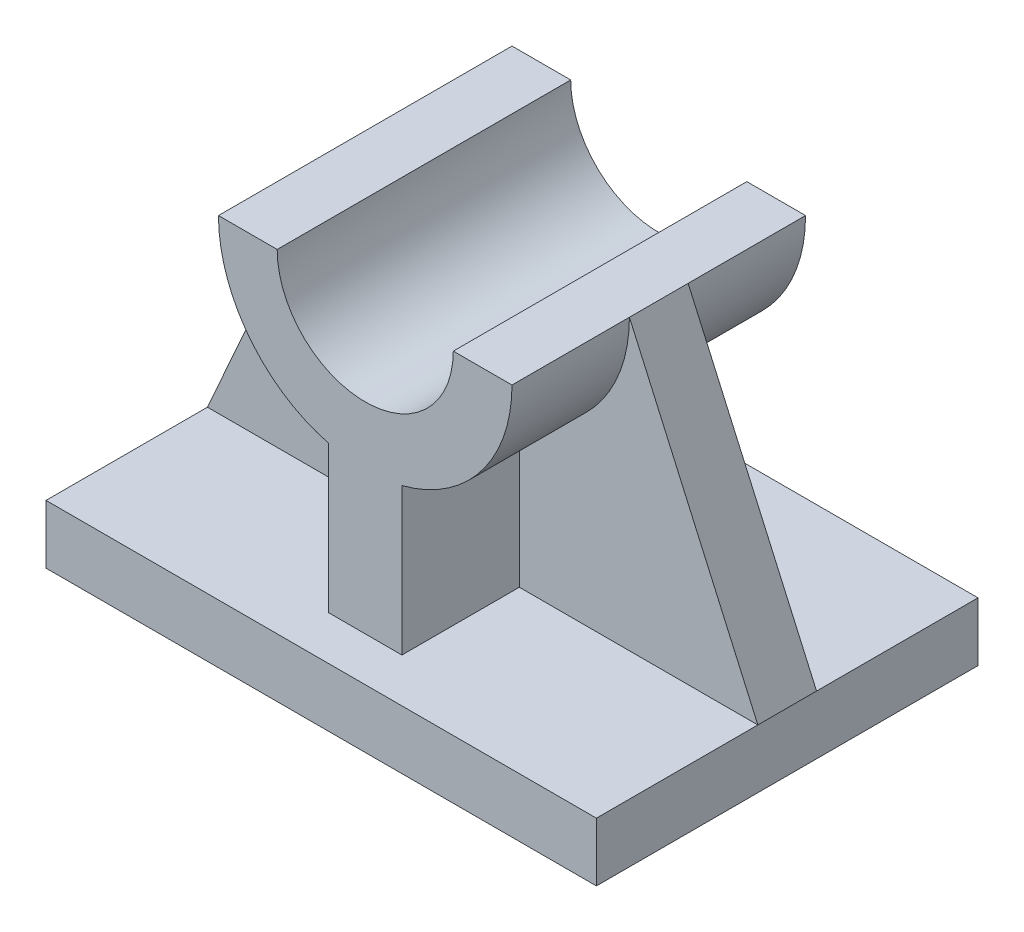
ISO-10303-21;
HEADER;
FILE_DESCRIPTION(('STEP AP214'),'2;1');
FILE_NAME('part.step','',(''),(''),'','','');
FILE_SCHEMA(('AUTOMOTIVE_DESIGN { 1 0 10303 214 1 1 1 1 }'));
ENDSEC;
DATA;
#1=APPLICATION_CONTEXT('core data for automotive mechanical design processes');
#2=APPLICATION_PROTOCOL_DEFINITION('international standard','automotive_design',2000,#1);
#3=PRODUCT_CONTEXT('',#1,'mechanical');
#4=PRODUCT('Part','Part','',(#3));
#5=PRODUCT_RELATED_PRODUCT_CATEGORY('part','',(#4));
#6=PRODUCT_DEFINITION_FORMATION('','',#4);
#7=PRODUCT_DEFINITION_CONTEXT('part definition',#1,'design');
#8=PRODUCT_DEFINITION('design','',#6,#7);
#9=PRODUCT_DEFINITION_SHAPE('','',#8);
#10=(LENGTH_UNIT() NAMED_UNIT(*) SI_UNIT(.MILLI.,.METRE.));
#11=(NAMED_UNIT(*) PLANE_ANGLE_UNIT() SI_UNIT($,.RADIAN.));
#12=(NAMED_UNIT(*) SI_UNIT($,.STERADIAN.) SOLID_ANGLE_UNIT());
#13=UNCERTAINTY_MEASURE_WITH_UNIT(LENGTH_MEASURE(1.E-05),#10,'distance_accuracy_value','');
#14=(GEOMETRIC_REPRESENTATION_CONTEXT(3) GLOBAL_UNCERTAINTY_ASSIGNED_CONTEXT((#13)) GLOBAL_UNIT_ASSIGNED_CONTEXT((#10,
#11,#12)) REPRESENTATION_CONTEXT('',''));
#15=CARTESIAN_POINT('',(0.,0.,0.));
#16=DIRECTION('',(0.,0.,1.));
#17=DIRECTION('',(1.,0.,0.));
#18=AXIS2_PLACEMENT_3D('',#15,#16,#17);
#19=CARTESIAN_POINT('',(0.,4.,26.));
#20=DIRECTION('',(0.,1.,0.));
#21=DIRECTION('',(-1.,0.,0.));
#22=AXIS2_PLACEMENT_3D('',#19,#20,#21);
#23=PLANE('',#22);
#24=DIRECTION('',(0.,0.,-1.));
#25=VECTOR('',#24,1.);
#26=CARTESIAN_POINT('',(37.5,4.,26.));
#27=LINE('',#26,#25);
#28=CARTESIAN_POINT('',(37.5,4.,26.));
#29=VERTEX_POINT('',#28);
#30=CARTESIAN_POINT('',(37.5,4.,4.));
#31=VERTEX_POINT('',#30);
#32=EDGE_CURVE('E234',#29,#31,#27,.T.);
#33=ORIENTED_EDGE('',*,*,#32,.T.);
#34=DIRECTION('',(-1.,0.,0.));
#35=VECTOR('',#34,1.);
#36=CARTESIAN_POINT('',(0.,4.,4.));
#37=LINE('',#36,#35);
#38=CARTESIAN_POINT('',(5.,4.,4.));
#39=VERTEX_POINT('',#38);
#40=EDGE_CURVE('E200',#31,#39,#37,.T.);
#41=ORIENTED_EDGE('',*,*,#40,.T.);
#42=DIRECTION('',(0.,0.,-1.));
#43=VECTOR('',#42,1.);
#44=CARTESIAN_POINT('',(5.,4.,20.));
#45=LINE('',#44,#43);
#46=CARTESIAN_POINT('',(5.,4.,20.));
#47=VERTEX_POINT('',#46);
#48=EDGE_CURVE('E196',#47,#39,#45,.T.);
#49=ORIENTED_EDGE('',*,*,#48,.F.);
#50=DIRECTION('',(1.,0.,0.));
#51=VECTOR('',#50,1.);
#52=CARTESIAN_POINT('',(0.,4.,20.));
#53=LINE('',#52,#51);
#54=CARTESIAN_POINT('',(-5.,4.,20.));
#55=VERTEX_POINT('',#54);
#56=EDGE_CURVE('E306',#55,#47,#53,.T.);
#57=ORIENTED_EDGE('',*,*,#56,.F.);
#58=DIRECTION('',(0.,0.,-1.));
#59=VECTOR('',#58,1.);
#60=CARTESIAN_POINT('',(-5.,4.,20.));
#61=LINE('',#60,#59);
#62=CARTESIAN_POINT('',(-5.,4.,4.));
#63=VERTEX_POINT('',#62);
#64=EDGE_CURVE('E340',#55,#63,#61,.T.);
#65=ORIENTED_EDGE('',*,*,#64,.T.);
#66=DIRECTION('',(-1.,0.,0.));
#67=VECTOR('',#66,1.);
#68=CARTESIAN_POINT('',(0.,4.,4.));
#69=LINE('',#68,#67);
#70=CARTESIAN_POINT('',(-37.5,4.,4.00000000000001));
#71=VERTEX_POINT('',#70);
#72=EDGE_CURVE('E272',#63,#71,#69,.T.);
#73=ORIENTED_EDGE('',*,*,#72,.T.);
#74=DIRECTION('',(0.,0.,-1.));
#75=VECTOR('',#74,1.);
#76=CARTESIAN_POINT('',(-37.5,4.,26.));
#77=LINE('',#76,#75);
#78=CARTESIAN_POINT('',(-37.5,4.,26.));
#79=VERTEX_POINT('',#78);
#80=EDGE_CURVE('E11',#79,#71,#77,.T.);
#81=ORIENTED_EDGE('',*,*,#80,.F.);
#82=DIRECTION('',(1.,0.,0.));
#83=VECTOR('',#82,1.);
#84=CARTESIAN_POINT('',(0.,4.,26.));
#85=LINE('',#84,#83);
#86=EDGE_CURVE('E212',#79,#29,#85,.T.);
#87=ORIENTED_EDGE('',*,*,#86,.T.);
#88=EDGE_LOOP('',(#33,#41,#49,#57,#65,#73,#81,#87));
#89=FACE_BOUND('',#88,.T.);
#90=ADVANCED_FACE('F41',(#89),#23,.T.);
#91=CARTESIAN_POINT('',(5.,0.,20.));
#92=DIRECTION('',(-1.,0.,0.));
#93=DIRECTION('',(0.,0.,1.));
#94=AXIS2_PLACEMENT_3D('',#91,#92,#93);
#95=PLANE('',#94);
#96=DIRECTION('',(0.,1.,0.));
#97=VECTOR('',#96,1.);
#98=CARTESIAN_POINT('',(5.,0.,-4.));
#99=LINE('',#98,#97);
#100=CARTESIAN_POINT('',(5.,4.,-4.));
#101=VERTEX_POINT('',#100);
#102=CARTESIAN_POINT('',(5.,24.,-4.));
#103=VERTEX_POINT('',#102);
#104=EDGE_CURVE('E378',#101,#103,#99,.T.);
#105=ORIENTED_EDGE('',*,*,#104,.F.);
#106=CARTESIAN_POINT('',(5.,4.,-20.));
#107=VERTEX_POINT('',#106);
#108=EDGE_CURVE('E309',#101,#107,#45,.T.);
#109=ORIENTED_EDGE('',*,*,#108,.T.);
#110=DIRECTION('',(0.,1.,0.));
#111=VECTOR('',#110,1.);
#112=CARTESIAN_POINT('',(5.,0.,-20.));
#113=LINE('',#112,#111);
#114=CARTESIAN_POINT('',(5.,24.,-20.));
#115=VERTEX_POINT('',#114);
#116=EDGE_CURVE('E313',#107,#115,#113,.T.);
#117=ORIENTED_EDGE('',*,*,#116,.T.);
#118=DIRECTION('',(0.,0.,-1.));
#119=VECTOR('',#118,1.);
#120=CARTESIAN_POINT('',(5.,24.,20.));
#121=LINE('',#120,#119);
#122=EDGE_CURVE('E202',#103,#115,#121,.T.);
#123=ORIENTED_EDGE('',*,*,#122,.F.);
#124=EDGE_LOOP('',(#105,#109,#117,#123));
#125=FACE_BOUND('',#124,.T.);
#126=ADVANCED_FACE('F414',(#125),#95,.F.);
#127=CARTESIAN_POINT('',(-5.,0.,20.));
#128=DIRECTION('',(-1.,0.,0.));
#129=DIRECTION('',(0.,0.,1.));
#130=AXIS2_PLACEMENT_3D('',#127,#128,#129);
#131=PLANE('',#130);
#132=CARTESIAN_POINT('',(-5.,4.,-4.));
#133=VERTEX_POINT('',#132);
#134=CARTESIAN_POINT('',(-5.,4.,-20.));
#135=VERTEX_POINT('',#134);
#136=EDGE_CURVE('E337',#133,#135,#61,.T.);
#137=ORIENTED_EDGE('',*,*,#136,.F.);
#138=DIRECTION('',(0.,1.,0.));
#139=VECTOR('',#138,1.);
#140=CARTESIAN_POINT('',(-5.,0.,-4.));
#141=LINE('',#140,#139);
#142=CARTESIAN_POINT('',(-5.,24.,-4.));
#143=VERTEX_POINT('',#142);
#144=EDGE_CURVE('E286',#133,#143,#141,.T.);
#145=ORIENTED_EDGE('',*,*,#144,.T.);
#146=DIRECTION('',(0.,0.,-1.));
#147=VECTOR('',#146,1.);
#148=CARTESIAN_POINT('',(-5.,24.,20.));
#149=LINE('',#148,#147);
#150=CARTESIAN_POINT('',(-5.,24.,-20.));
#151=VERTEX_POINT('',#150);
#152=EDGE_CURVE('E336',#143,#151,#149,.T.);
#153=ORIENTED_EDGE('',*,*,#152,.T.);
#154=DIRECTION('',(0.,1.,0.));
#155=VECTOR('',#154,1.);
#156=CARTESIAN_POINT('',(-5.,0.,-20.));
#157=LINE('',#156,#155);
#158=EDGE_CURVE('E329',#135,#151,#157,.T.);
#159=ORIENTED_EDGE('',*,*,#158,.F.);
#160=EDGE_LOOP('',(#137,#145,#153,#159));
#161=FACE_BOUND('',#160,.T.);
#162=ADVANCED_FACE('F393',(#161),#131,.T.);
#163=CARTESIAN_POINT('',(0.,43.3649167310371,20.));
#164=DIRECTION('',(0.,0.,-1.));
#165=DIRECTION('',(-1.,0.,0.));
#166=AXIS2_PLACEMENT_3D('',#163,#164,#165);
#167=CYLINDRICAL_SURFACE('',#166,20.);
#168=CARTESIAN_POINT('',(0.,43.3649167310371,-4.));
#169=DIRECTION('',(0.,0.,1.));
#170=DIRECTION('',(1.,0.,0.));
#171=AXIS2_PLACEMENT_3D('',#168,#169,#170);
#172=CIRCLE('',#171,20.);
#173=CARTESIAN_POINT('',(20.,43.3649167310371,-4.));
#174=VERTEX_POINT('',#173);
#175=EDGE_CURVE('E281',#103,#174,#172,.T.);
#176=ORIENTED_EDGE('',*,*,#175,.F.);
#177=ORIENTED_EDGE('',*,*,#122,.T.);
#178=CARTESIAN_POINT('',(0.,43.3649167310371,-20.));
#179=DIRECTION('',(0.,0.,1.));
#180=DIRECTION('',(1.,0.,0.));
#181=AXIS2_PLACEMENT_3D('',#178,#179,#180);
#182=CIRCLE('',#181,20.);
#183=CARTESIAN_POINT('',(20.,43.3649167310371,-20.));
#184=VERTEX_POINT('',#183);
#185=EDGE_CURVE('E314',#115,#184,#182,.T.);
#186=ORIENTED_EDGE('',*,*,#185,.T.);
#187=DIRECTION('',(0.,0.,-1.));
#188=VECTOR('',#187,1.);
#189=CARTESIAN_POINT('',(20.,43.3649167310371,20.));
#190=LINE('',#189,#188);
#191=EDGE_CURVE('E346',#174,#184,#190,.T.);
#192=ORIENTED_EDGE('',*,*,#191,.F.);
#193=EDGE_LOOP('',(#176,#177,#186,#192));
#194=FACE_BOUND('',#193,.T.);
#195=ADVANCED_FACE('F426',(#194),#167,.T.);
#196=CARTESIAN_POINT('',(0.,43.3649167310371,20.));
#197=DIRECTION('',(0.,0.,-1.));
#198=DIRECTION('',(-1.,0.,0.));
#199=AXIS2_PLACEMENT_3D('',#196,#197,#198);
#200=CYLINDRICAL_SURFACE('',#199,20.);
#201=CARTESIAN_POINT('',(0.,43.3649167310371,-4.));
#202=DIRECTION('',(0.,0.,1.));
#203=DIRECTION('',(1.,0.,0.));
#204=AXIS2_PLACEMENT_3D('',#201,#202,#203);
#205=CIRCLE('',#204,20.);
#206=CARTESIAN_POINT('',(-20.,43.3649167310371,-4.));
#207=VERTEX_POINT('',#206);
#208=EDGE_CURVE('E389',#207,#143,#205,.T.);
#209=ORIENTED_EDGE('',*,*,#208,.F.);
#210=DIRECTION('',(0.,0.,-1.));
#211=VECTOR('',#210,1.);
#212=CARTESIAN_POINT('',(-20.,43.3649167310371,20.));
#213=LINE('',#212,#211);
#214=CARTESIAN_POINT('',(-20.,43.3649167310371,-20.));
#215=VERTEX_POINT('',#214);
#216=EDGE_CURVE('E345',#207,#215,#213,.T.);
#217=ORIENTED_EDGE('',*,*,#216,.T.);
#218=CARTESIAN_POINT('',(0.,43.3649167310371,-20.));
#219=DIRECTION('',(0.,0.,1.));
#220=DIRECTION('',(1.,0.,0.));
#221=AXIS2_PLACEMENT_3D('',#218,#219,#220);
#222=CIRCLE('',#221,20.);
#223=EDGE_CURVE('E330',#215,#151,#222,.T.);
#224=ORIENTED_EDGE('',*,*,#223,.T.);
#225=ORIENTED_EDGE('',*,*,#152,.F.);
#226=EDGE_LOOP('',(#209,#217,#224,#225));
#227=FACE_BOUND('',#226,.T.);
#228=ADVANCED_FACE('F396',(#227),#200,.T.);
#229=DIRECTION('',(-1.,0.,0.));
#230=VECTOR('',#229,1.);
#231=CARTESIAN_POINT('',(0.,4.,-4.));
#232=LINE('',#231,#230);
#233=CARTESIAN_POINT('',(37.5,4.,-4.));
#234=VERTEX_POINT('',#233);
#235=EDGE_CURVE('E379',#234,#101,#232,.T.);
#236=ORIENTED_EDGE('',*,*,#235,.F.);
#237=CARTESIAN_POINT('',(37.5,4.,-26.));
#238=VERTEX_POINT('',#237);
#239=EDGE_CURVE('E223',#234,#238,#27,.T.);
#240=ORIENTED_EDGE('',*,*,#239,.T.);
#241=DIRECTION('',(1.,0.,0.));
#242=VECTOR('',#241,1.);
#243=CARTESIAN_POINT('',(0.,4.,-26.));
#244=LINE('',#243,#242);
#245=CARTESIAN_POINT('',(-37.5,4.,-26.));
#246=VERTEX_POINT('',#245);
#247=EDGE_CURVE('E204',#246,#238,#244,.T.);
#248=ORIENTED_EDGE('',*,*,#247,.F.);
#249=CARTESIAN_POINT('',(-37.5,4.,-3.99999999999999));
#250=VERTEX_POINT('',#249);
#251=EDGE_CURVE('E47',#250,#246,#77,.T.);
#252=ORIENTED_EDGE('',*,*,#251,.F.);
#253=DIRECTION('',(-1.,0.,0.));
#254=VECTOR('',#253,1.);
#255=CARTESIAN_POINT('',(0.,4.,-4.));
#256=LINE('',#255,#254);
#257=EDGE_CURVE('E57',#133,#250,#256,.T.);
#258=ORIENTED_EDGE('',*,*,#257,.F.);
#259=ORIENTED_EDGE('',*,*,#136,.T.);
#260=DIRECTION('',(1.,0.,0.));
#261=VECTOR('',#260,1.);
#262=CARTESIAN_POINT('',(0.,4.,-20.));
#263=LINE('',#262,#261);
#264=EDGE_CURVE('E291',#135,#107,#263,.T.);
#265=ORIENTED_EDGE('',*,*,#264,.T.);
#266=ORIENTED_EDGE('',*,*,#108,.F.);
#267=EDGE_LOOP('',(#236,#240,#248,#252,#258,#259,#265,#266));
#268=FACE_BOUND('',#267,.T.);
#269=ADVANCED_FACE('F43',(#268),#23,.T.);
#270=CARTESIAN_POINT('',(-37.5,0.,26.));
#271=DIRECTION('',(-1.,0.,0.));
#272=DIRECTION('',(0.,0.,1.));
#273=AXIS2_PLACEMENT_3D('',#270,#271,#272);
#274=PLANE('',#273);
#275=DIRECTION('',(0.,1.,0.));
#276=VECTOR('',#275,1.);
#277=CARTESIAN_POINT('',(-37.5,0.,-26.));
#278=LINE('',#277,#276);
#279=CARTESIAN_POINT('',(-37.5,-4.,-26.));
#280=VERTEX_POINT('',#279);
#281=EDGE_CURVE('E208',#280,#246,#278,.T.);
#282=ORIENTED_EDGE('',*,*,#281,.F.);
#283=DIRECTION('',(0.,0.,-1.));
#284=VECTOR('',#283,1.);
#285=CARTESIAN_POINT('',(-37.5,-4.,26.));
#286=LINE('',#285,#284);
#287=CARTESIAN_POINT('',(-37.5,-4.,26.));
#288=VERTEX_POINT('',#287);
#289=EDGE_CURVE('E236',#288,#280,#286,.T.);
#290=ORIENTED_EDGE('',*,*,#289,.F.);
#291=DIRECTION('',(0.,1.,0.));
#292=VECTOR('',#291,1.);
#293=CARTESIAN_POINT('',(-37.5,0.,26.));
#294=LINE('',#293,#292);
#295=EDGE_CURVE('E220',#288,#79,#294,.T.);
#296=ORIENTED_EDGE('',*,*,#295,.T.);
#297=ORIENTED_EDGE('',*,*,#80,.T.);
#298=DIRECTION('',(0.,0.,-1.));
#299=VECTOR('',#298,1.);
#300=CARTESIAN_POINT('',(-37.5,4.,4.));
#301=LINE('',#300,#299);
#302=EDGE_CURVE('E250',#71,#250,#301,.T.);
#303=ORIENTED_EDGE('',*,*,#302,.T.);
#304=ORIENTED_EDGE('',*,*,#251,.T.);
#305=EDGE_LOOP('',(#282,#290,#296,#297,#303,#304));
#306=FACE_BOUND('',#305,.T.);
#307=ADVANCED_FACE('F243',(#306),#274,.T.);
#308=CARTESIAN_POINT('',(0.,-4.,26.));
#309=DIRECTION('',(0.,-1.,0.));
#310=DIRECTION('',(1.,0.,0.));
#311=AXIS2_PLACEMENT_3D('',#308,#309,#310);
#312=PLANE('',#311);
#313=DIRECTION('',(-1.,0.,0.));
#314=VECTOR('',#313,1.);
#315=CARTESIAN_POINT('',(0.,-4.,-26.));
#316=LINE('',#315,#314);
#317=CARTESIAN_POINT('',(37.5,-3.99999999999999,-26.));
#318=VERTEX_POINT('',#317);
#319=EDGE_CURVE('E226',#318,#280,#316,.T.);
#320=ORIENTED_EDGE('',*,*,#319,.F.);
#321=DIRECTION('',(0.,0.,-1.));
#322=VECTOR('',#321,1.);
#323=CARTESIAN_POINT('',(37.5,-3.99999999999999,26.));
#324=LINE('',#323,#322);
#325=CARTESIAN_POINT('',(37.5,-3.99999999999999,26.));
#326=VERTEX_POINT('',#325);
#327=EDGE_CURVE('E240',#326,#318,#324,.T.);
#328=ORIENTED_EDGE('',*,*,#327,.F.);
#329=DIRECTION('',(-1.,0.,0.));
#330=VECTOR('',#329,1.);
#331=CARTESIAN_POINT('',(0.,-4.,26.));
#332=LINE('',#331,#330);
#333=EDGE_CURVE('E222',#326,#288,#332,.T.);
#334=ORIENTED_EDGE('',*,*,#333,.T.);
#335=ORIENTED_EDGE('',*,*,#289,.T.);
#336=EDGE_LOOP('',(#320,#328,#334,#335));
#337=FACE_BOUND('',#336,.T.);
#338=ADVANCED_FACE('F255',(#337),#312,.T.);
#339=CARTESIAN_POINT('',(37.5,0.,26.));
#340=DIRECTION('',(-1.,0.,0.));
#341=DIRECTION('',(0.,0.,1.));
#342=AXIS2_PLACEMENT_3D('',#339,#340,#341);
#343=PLANE('',#342);
#344=DIRECTION('',(0.,1.,0.));
#345=VECTOR('',#344,1.);
#346=CARTESIAN_POINT('',(37.5,0.,-26.));
#347=LINE('',#346,#345);
#348=EDGE_CURVE('E217',#318,#238,#347,.T.);
#349=ORIENTED_EDGE('',*,*,#348,.T.);
#350=ORIENTED_EDGE('',*,*,#239,.F.);
#351=DIRECTION('',(0.,0.,-1.));
#352=VECTOR('',#351,1.);
#353=CARTESIAN_POINT('',(37.5,4.,4.));
#354=LINE('',#353,#352);
#355=EDGE_CURVE('E312',#31,#234,#354,.T.);
#356=ORIENTED_EDGE('',*,*,#355,.F.);
#357=ORIENTED_EDGE('',*,*,#32,.F.);
#358=DIRECTION('',(0.,1.,0.));
#359=VECTOR('',#358,1.);
#360=CARTESIAN_POINT('',(37.5,0.,26.));
#361=LINE('',#360,#359);
#362=EDGE_CURVE('E221',#326,#29,#361,.T.);
#363=ORIENTED_EDGE('',*,*,#362,.F.);
#364=ORIENTED_EDGE('',*,*,#327,.T.);
#365=EDGE_LOOP('',(#349,#350,#356,#357,#363,#364));
#366=FACE_BOUND('',#365,.T.);
#367=ADVANCED_FACE('F259',(#366),#343,.F.);
#368=CARTESIAN_POINT('',(0.,0.,26.));
#369=DIRECTION('',(0.,0.,1.));
#370=DIRECTION('',(1.,0.,0.));
#371=AXIS2_PLACEMENT_3D('',#368,#369,#370);
#372=PLANE('',#371);
#373=ORIENTED_EDGE('',*,*,#86,.F.);
#374=ORIENTED_EDGE('',*,*,#295,.F.);
#375=ORIENTED_EDGE('',*,*,#333,.F.);
#376=ORIENTED_EDGE('',*,*,#362,.T.);
#377=EDGE_LOOP('',(#373,#374,#375,#376));
#378=FACE_BOUND('',#377,.T.);
#379=ADVANCED_FACE('F262',(#378),#372,.T.);
#380=CARTESIAN_POINT('',(0.,0.,-26.));
#381=DIRECTION('',(0.,0.,1.));
#382=DIRECTION('',(1.,0.,0.));
#383=AXIS2_PLACEMENT_3D('',#380,#381,#382);
#384=PLANE('',#383);
#385=ORIENTED_EDGE('',*,*,#247,.T.);
#386=ORIENTED_EDGE('',*,*,#348,.F.);
#387=ORIENTED_EDGE('',*,*,#319,.T.);
#388=ORIENTED_EDGE('',*,*,#281,.T.);
#389=EDGE_LOOP('',(#385,#386,#387,#388));
#390=FACE_BOUND('',#389,.T.);
#391=ADVANCED_FACE('F251',(#390),#384,.F.);
#392=ORIENTED_EDGE('',*,*,#48,.T.);
#393=DIRECTION('',(0.,1.,0.));
#394=VECTOR('',#393,1.);
#395=CARTESIAN_POINT('',(5.,0.,4.));
#396=LINE('',#395,#394);
#397=CARTESIAN_POINT('',(5.,24.,4.));
#398=VERTEX_POINT('',#397);
#399=EDGE_CURVE('E177',#39,#398,#396,.T.);
#400=ORIENTED_EDGE('',*,*,#399,.T.);
#401=CARTESIAN_POINT('',(5.,24.,20.));
#402=VERTEX_POINT('',#401);
#403=EDGE_CURVE('E198',#402,#398,#121,.T.);
#404=ORIENTED_EDGE('',*,*,#403,.F.);
#405=DIRECTION('',(0.,1.,0.));
#406=VECTOR('',#405,1.);
#407=CARTESIAN_POINT('',(5.,0.,20.));
#408=LINE('',#407,#406);
#409=EDGE_CURVE('E292',#47,#402,#408,.T.);
#410=ORIENTED_EDGE('',*,*,#409,.F.);
#411=EDGE_LOOP('',(#392,#400,#404,#410));
#412=FACE_BOUND('',#411,.T.);
#413=ADVANCED_FACE('F194',(#412),#95,.F.);
#414=ORIENTED_EDGE('',*,*,#403,.T.);
#415=CARTESIAN_POINT('',(0.,43.3649167310371,4.));
#416=DIRECTION('',(0.,0.,1.));
#417=DIRECTION('',(1.,0.,0.));
#418=AXIS2_PLACEMENT_3D('',#415,#416,#417);
#419=CIRCLE('',#418,20.);
#420=CARTESIAN_POINT('',(20.,43.3649167310371,4.));
#421=VERTEX_POINT('',#420);
#422=EDGE_CURVE('E180',#398,#421,#419,.T.);
#423=ORIENTED_EDGE('',*,*,#422,.T.);
#424=CARTESIAN_POINT('',(20.,43.3649167310371,20.));
#425=VERTEX_POINT('',#424);
#426=EDGE_CURVE('E209',#425,#421,#190,.T.);
#427=ORIENTED_EDGE('',*,*,#426,.F.);
#428=CARTESIAN_POINT('',(0.,43.3649167310371,20.));
#429=DIRECTION('',(0.,0.,1.));
#430=DIRECTION('',(1.,0.,0.));
#431=AXIS2_PLACEMENT_3D('',#428,#429,#430);
#432=CIRCLE('',#431,20.);
#433=EDGE_CURVE('E205',#402,#425,#432,.T.);
#434=ORIENTED_EDGE('',*,*,#433,.F.);
#435=EDGE_LOOP('',(#414,#423,#427,#434));
#436=FACE_BOUND('',#435,.T.);
#437=ADVANCED_FACE('F203',(#436),#167,.T.);
#438=CARTESIAN_POINT('',(0.,43.3649167310371,20.));
#439=DIRECTION('',(0.,1.,0.));
#440=DIRECTION('',(0.,0.,1.));
#441=AXIS2_PLACEMENT_3D('',#438,#439,#440);
#442=PLANE('',#441);
#443=DIRECTION('',(1.,0.,0.));
#444=VECTOR('',#443,1.);
#445=CARTESIAN_POINT('',(0.,43.3649167310371,-20.));
#446=LINE('',#445,#444);
#447=CARTESIAN_POINT('',(12.,43.3649167310371,-20.));
#448=VERTEX_POINT('',#447);
#449=EDGE_CURVE('E318',#448,#184,#446,.T.);
#450=ORIENTED_EDGE('',*,*,#449,.F.);
#451=DIRECTION('',(0.,0.,-1.));
#452=VECTOR('',#451,1.);
#453=CARTESIAN_POINT('',(12.,43.3649167310371,20.));
#454=LINE('',#453,#452);
#455=CARTESIAN_POINT('',(12.,43.3649167310371,20.));
#456=VERTEX_POINT('',#455);
#457=EDGE_CURVE('E350',#456,#448,#454,.T.);
#458=ORIENTED_EDGE('',*,*,#457,.F.);
#459=DIRECTION('',(1.,0.,0.));
#460=VECTOR('',#459,1.);
#461=CARTESIAN_POINT('',(0.,43.3649167310371,20.));
#462=LINE('',#461,#460);
#463=EDGE_CURVE('E293',#456,#425,#462,.T.);
#464=ORIENTED_EDGE('',*,*,#463,.T.);
#465=ORIENTED_EDGE('',*,*,#426,.T.);
#466=DIRECTION('',(0.,0.,-1.));
#467=VECTOR('',#466,1.);
#468=CARTESIAN_POINT('',(20.,43.3649167310371,4.));
#469=LINE('',#468,#467);
#470=EDGE_CURVE('E358',#421,#174,#469,.T.);
#471=ORIENTED_EDGE('',*,*,#470,.T.);
#472=ORIENTED_EDGE('',*,*,#191,.T.);
#473=EDGE_LOOP('',(#450,#458,#464,#465,#471,#472));
#474=FACE_BOUND('',#473,.T.);
#475=ADVANCED_FACE('F353',(#474),#442,.T.);
#476=CARTESIAN_POINT('',(0.,43.3649167310371,20.));
#477=DIRECTION('',(0.,0.,-1.));
#478=DIRECTION('',(-1.,0.,0.));
#479=AXIS2_PLACEMENT_3D('',#476,#477,#478);
#480=CYLINDRICAL_SURFACE('',#479,12.);
#481=CARTESIAN_POINT('',(0.,43.3649167310371,-20.));
#482=DIRECTION('',(0.,0.,1.));
#483=DIRECTION('',(1.,0.,0.));
#484=AXIS2_PLACEMENT_3D('',#481,#482,#483);
#485=CIRCLE('',#484,12.);
#486=CARTESIAN_POINT('',(-12.,43.3649167310371,-20.));
#487=VERTEX_POINT('',#486);
#488=EDGE_CURVE('E321',#487,#448,#485,.T.);
#489=ORIENTED_EDGE('',*,*,#488,.F.);
#490=DIRECTION('',(0.,0.,-1.));
#491=VECTOR('',#490,1.);
#492=CARTESIAN_POINT('',(-12.,43.3649167310371,20.));
#493=LINE('',#492,#491);
#494=CARTESIAN_POINT('',(-12.,43.3649167310371,20.));
#495=VERTEX_POINT('',#494);
#496=EDGE_CURVE('E347',#495,#487,#493,.T.);
#497=ORIENTED_EDGE('',*,*,#496,.F.);
#498=CARTESIAN_POINT('',(0.,43.3649167310371,20.));
#499=DIRECTION('',(0.,0.,1.));
#500=DIRECTION('',(1.,0.,0.));
#501=AXIS2_PLACEMENT_3D('',#498,#499,#500);
#502=CIRCLE('',#501,12.);
#503=EDGE_CURVE('E299',#495,#456,#502,.T.);
#504=ORIENTED_EDGE('',*,*,#503,.T.);
#505=ORIENTED_EDGE('',*,*,#457,.T.);
#506=EDGE_LOOP('',(#489,#497,#504,#505));
#507=FACE_BOUND('',#506,.T.);
#508=ADVANCED_FACE('F363',(#507),#480,.F.);
#509=CARTESIAN_POINT('',(0.,43.3649167310371,20.));
#510=DIRECTION('',(0.,-1.,0.));
#511=DIRECTION('',(0.,0.,-1.));
#512=AXIS2_PLACEMENT_3D('',#509,#510,#511);
#513=PLANE('',#512);
#514=DIRECTION('',(-1.,0.,0.));
#515=VECTOR('',#514,1.);
#516=CARTESIAN_POINT('',(0.,43.3649167310371,-20.));
#517=LINE('',#516,#515);
#518=EDGE_CURVE('E322',#487,#215,#517,.T.);
#519=ORIENTED_EDGE('',*,*,#518,.T.);
#520=ORIENTED_EDGE('',*,*,#216,.F.);
#521=DIRECTION('',(0.,0.,-1.));
#522=VECTOR('',#521,1.);
#523=CARTESIAN_POINT('',(-20.,43.3649167310371,4.));
#524=LINE('',#523,#522);
#525=CARTESIAN_POINT('',(-20.,43.3649167310371,4.));
#526=VERTEX_POINT('',#525);
#527=EDGE_CURVE('E285',#526,#207,#524,.T.);
#528=ORIENTED_EDGE('',*,*,#527,.F.);
#529=CARTESIAN_POINT('',(-20.,43.3649167310371,20.));
#530=VERTEX_POINT('',#529);
#531=EDGE_CURVE('E341',#530,#526,#213,.T.);
#532=ORIENTED_EDGE('',*,*,#531,.F.);
#533=DIRECTION('',(-1.,0.,0.));
#534=VECTOR('',#533,1.);
#535=CARTESIAN_POINT('',(0.,43.3649167310371,20.));
#536=LINE('',#535,#534);
#537=EDGE_CURVE('E303',#495,#530,#536,.T.);
#538=ORIENTED_EDGE('',*,*,#537,.F.);
#539=ORIENTED_EDGE('',*,*,#496,.T.);
#540=EDGE_LOOP('',(#519,#520,#528,#532,#538,#539));
#541=FACE_BOUND('',#540,.T.);
#542=ADVANCED_FACE('F368',(#541),#513,.F.);
#543=ORIENTED_EDGE('',*,*,#531,.T.);
#544=CARTESIAN_POINT('',(0.,43.3649167310371,4.));
#545=DIRECTION('',(0.,0.,1.));
#546=DIRECTION('',(1.,0.,0.));
#547=AXIS2_PLACEMENT_3D('',#544,#545,#546);
#548=CIRCLE('',#547,20.);
#549=CARTESIAN_POINT('',(-5.,24.,4.));
#550=VERTEX_POINT('',#549);
#551=EDGE_CURVE('E274',#526,#550,#548,.T.);
#552=ORIENTED_EDGE('',*,*,#551,.T.);
#553=CARTESIAN_POINT('',(-5.,24.,20.));
#554=VERTEX_POINT('',#553);
#555=EDGE_CURVE('E338',#554,#550,#149,.T.);
#556=ORIENTED_EDGE('',*,*,#555,.F.);
#557=CARTESIAN_POINT('',(0.,43.3649167310371,20.));
#558=DIRECTION('',(0.,0.,1.));
#559=DIRECTION('',(1.,0.,0.));
#560=AXIS2_PLACEMENT_3D('',#557,#558,#559);
#561=CIRCLE('',#560,20.);
#562=EDGE_CURVE('E301',#530,#554,#561,.T.);
#563=ORIENTED_EDGE('',*,*,#562,.F.);
#564=EDGE_LOOP('',(#543,#552,#556,#563));
#565=FACE_BOUND('',#564,.T.);
#566=ADVANCED_FACE('F375',(#565),#200,.T.);
#567=DIRECTION('',(0.,1.,0.));
#568=VECTOR('',#567,1.);
#569=CARTESIAN_POINT('',(-5.,0.,4.));
#570=LINE('',#569,#568);
#571=EDGE_CURVE('E61',#63,#550,#570,.T.);
#572=ORIENTED_EDGE('',*,*,#571,.F.);
#573=ORIENTED_EDGE('',*,*,#64,.F.);
#574=DIRECTION('',(0.,1.,0.));
#575=VECTOR('',#574,1.);
#576=CARTESIAN_POINT('',(-5.,0.,20.));
#577=LINE('',#576,#575);
#578=EDGE_CURVE('E302',#55,#554,#577,.T.);
#579=ORIENTED_EDGE('',*,*,#578,.T.);
#580=ORIENTED_EDGE('',*,*,#555,.T.);
#581=EDGE_LOOP('',(#572,#573,#579,#580));
#582=FACE_BOUND('',#581,.T.);
#583=ADVANCED_FACE('F373',(#582),#131,.T.);
#584=CARTESIAN_POINT('',(0.,0.,20.));
#585=DIRECTION('',(0.,0.,1.));
#586=DIRECTION('',(1.,0.,0.));
#587=AXIS2_PLACEMENT_3D('',#584,#585,#586);
#588=PLANE('',#587);
#589=ORIENTED_EDGE('',*,*,#409,.T.);
#590=ORIENTED_EDGE('',*,*,#433,.T.);
#591=ORIENTED_EDGE('',*,*,#463,.F.);
#592=ORIENTED_EDGE('',*,*,#503,.F.);
#593=ORIENTED_EDGE('',*,*,#537,.T.);
#594=ORIENTED_EDGE('',*,*,#562,.T.);
#595=ORIENTED_EDGE('',*,*,#578,.F.);
#596=ORIENTED_EDGE('',*,*,#56,.T.);
#597=EDGE_LOOP('',(#589,#590,#591,#592,#593,#594,#595,#596));
#598=FACE_BOUND('',#597,.T.);
#599=ADVANCED_FACE('F357',(#598),#588,.T.);
#600=CARTESIAN_POINT('',(0.,0.,-20.));
#601=DIRECTION('',(0.,0.,1.));
#602=DIRECTION('',(1.,0.,0.));
#603=AXIS2_PLACEMENT_3D('',#600,#601,#602);
#604=PLANE('',#603);
#605=ORIENTED_EDGE('',*,*,#116,.F.);
#606=ORIENTED_EDGE('',*,*,#264,.F.);
#607=ORIENTED_EDGE('',*,*,#158,.T.);
#608=ORIENTED_EDGE('',*,*,#223,.F.);
#609=ORIENTED_EDGE('',*,*,#518,.F.);
#610=ORIENTED_EDGE('',*,*,#488,.T.);
#611=ORIENTED_EDGE('',*,*,#449,.T.);
#612=ORIENTED_EDGE('',*,*,#185,.F.);
#613=EDGE_LOOP('',(#605,#606,#607,#608,#609,#610,#611,#612));
#614=FACE_BOUND('',#613,.T.);
#615=ADVANCED_FACE('F483',(#614),#604,.F.);
#616=CARTESIAN_POINT('',(-32.7965775818134,14.5799903910177,4.));
#617=DIRECTION('',(0.913772936380248,-0.406225332468347,0.));
#618=DIRECTION('',(0.406225332468347,0.913772936380248,0.));
#619=AXIS2_PLACEMENT_3D('',#616,#617,#618);
#620=PLANE('',#619);
#621=DIRECTION('',(-0.406225332468347,-0.913772936380248,0.));
#622=VECTOR('',#621,1.);
#623=CARTESIAN_POINT('',(-32.7965775818134,14.5799903910177,-4.));
#624=LINE('',#623,#622);
#625=EDGE_CURVE('E282',#207,#250,#624,.T.);
#626=ORIENTED_EDGE('',*,*,#625,.T.);
#627=ORIENTED_EDGE('',*,*,#302,.F.);
#628=DIRECTION('',(-0.406225332468347,-0.913772936380248,0.));
#629=VECTOR('',#628,1.);
#630=CARTESIAN_POINT('',(-32.7965775818134,14.5799903910177,4.));
#631=LINE('',#630,#629);
#632=EDGE_CURVE('E271',#526,#71,#631,.T.);
#633=ORIENTED_EDGE('',*,*,#632,.F.);
#634=ORIENTED_EDGE('',*,*,#527,.T.);
#635=EDGE_LOOP('',(#626,#627,#633,#634));
#636=FACE_BOUND('',#635,.T.);
#637=ADVANCED_FACE('F276',(#636),#620,.F.);
#638=CARTESIAN_POINT('',(0.,0.,4.));
#639=DIRECTION('',(0.,0.,1.));
#640=DIRECTION('',(1.,0.,0.));
#641=AXIS2_PLACEMENT_3D('',#638,#639,#640);
#642=PLANE('',#641);
#643=ORIENTED_EDGE('',*,*,#551,.F.);
#644=ORIENTED_EDGE('',*,*,#632,.T.);
#645=ORIENTED_EDGE('',*,*,#72,.F.);
#646=ORIENTED_EDGE('',*,*,#571,.T.);
#647=EDGE_LOOP('',(#643,#644,#645,#646));
#648=FACE_BOUND('',#647,.T.);
#649=ADVANCED_FACE('F275',(#648),#642,.T.);
#650=CARTESIAN_POINT('',(0.,0.,-4.));
#651=DIRECTION('',(0.,0.,1.));
#652=DIRECTION('',(1.,0.,0.));
#653=AXIS2_PLACEMENT_3D('',#650,#651,#652);
#654=PLANE('',#653);
#655=ORIENTED_EDGE('',*,*,#208,.T.);
#656=ORIENTED_EDGE('',*,*,#144,.F.);
#657=ORIENTED_EDGE('',*,*,#257,.T.);
#658=ORIENTED_EDGE('',*,*,#625,.F.);
#659=EDGE_LOOP('',(#655,#656,#657,#658));
#660=FACE_BOUND('',#659,.T.);
#661=ADVANCED_FACE('F402',(#660),#654,.F.);
#662=CARTESIAN_POINT('',(32.7965775818134,14.5799903910177,4.));
#663=DIRECTION('',(0.913772936380248,0.406225332468347,0.));
#664=DIRECTION('',(-0.406225332468347,0.913772936380248,0.));
#665=AXIS2_PLACEMENT_3D('',#662,#663,#664);
#666=PLANE('',#665);
#667=DIRECTION('',(0.406225332468347,-0.913772936380248,0.));
#668=VECTOR('',#667,1.);
#669=CARTESIAN_POINT('',(32.7965775818134,14.5799903910177,-4.));
#670=LINE('',#669,#668);
#671=EDGE_CURVE('E186',#174,#234,#670,.T.);
#672=ORIENTED_EDGE('',*,*,#671,.F.);
#673=ORIENTED_EDGE('',*,*,#470,.F.);
#674=DIRECTION('',(0.406225332468347,-0.913772936380248,0.));
#675=VECTOR('',#674,1.);
#676=CARTESIAN_POINT('',(32.7965775818134,14.5799903910177,4.));
#677=LINE('',#676,#675);
#678=EDGE_CURVE('E181',#421,#31,#677,.T.);
#679=ORIENTED_EDGE('',*,*,#678,.T.);
#680=ORIENTED_EDGE('',*,*,#355,.T.);
#681=EDGE_LOOP('',(#672,#673,#679,#680));
#682=FACE_BOUND('',#681,.T.);
#683=ADVANCED_FACE('F401',(#682),#666,.T.);
#684=CARTESIAN_POINT('',(0.,0.,4.));
#685=DIRECTION('',(0.,0.,1.));
#686=DIRECTION('',(1.,0.,0.));
#687=AXIS2_PLACEMENT_3D('',#684,#685,#686);
#688=PLANE('',#687);
#689=ORIENTED_EDGE('',*,*,#422,.F.);
#690=ORIENTED_EDGE('',*,*,#399,.F.);
#691=ORIENTED_EDGE('',*,*,#40,.F.);
#692=ORIENTED_EDGE('',*,*,#678,.F.);
#693=EDGE_LOOP('',(#689,#690,#691,#692));
#694=FACE_BOUND('',#693,.T.);
#695=ADVANCED_FACE('F179',(#694),#688,.T.);
#696=CARTESIAN_POINT('',(0.,0.,-4.));
#697=DIRECTION('',(0.,0.,1.));
#698=DIRECTION('',(1.,0.,0.));
#699=AXIS2_PLACEMENT_3D('',#696,#697,#698);
#700=PLANE('',#699);
#701=ORIENTED_EDGE('',*,*,#175,.T.);
#702=ORIENTED_EDGE('',*,*,#671,.T.);
#703=ORIENTED_EDGE('',*,*,#235,.T.);
#704=ORIENTED_EDGE('',*,*,#104,.T.);
#705=EDGE_LOOP('',(#701,#702,#703,#704));
#706=FACE_BOUND('',#705,.T.);
#707=ADVANCED_FACE('F556',(#706),#700,.F.);
#708=CLOSED_SHELL('',(#90,#126,#162,#195,#228,#269,#307,#338,#367,#379,#391,#413,#437,#475,#508,
#542,#566,#583,#599,#615,#637,#649,#661,#683,#695,#707));
#709=MANIFOLD_SOLID_BREP('B2',#708);
#710=ADVANCED_BREP_SHAPE_REPRESENTATION('',(#18,#709),#14);
#711=SHAPE_DEFINITION_REPRESENTATION(#9,#710);
ENDSEC;
END-ISO-10303-21;
